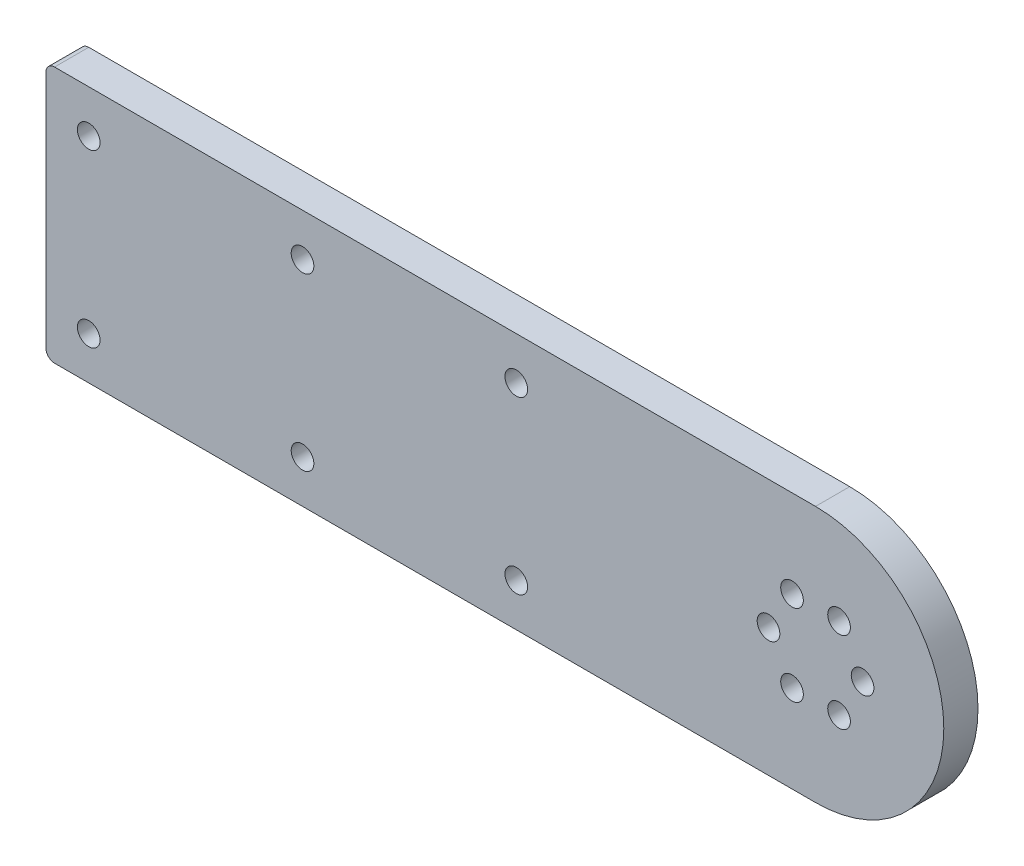
ISO-10303-21;
HEADER;
FILE_DESCRIPTION(('STEP AP214'),'2;1');
FILE_NAME('part.step','',(''),(''),'','','');
FILE_SCHEMA(('AUTOMOTIVE_DESIGN { 1 0 10303 214 1 1 1 1 }'));
ENDSEC;
DATA;
#1=APPLICATION_CONTEXT('core data for automotive mechanical design processes');
#2=APPLICATION_PROTOCOL_DEFINITION('international standard','automotive_design',2000,#1);
#3=PRODUCT_CONTEXT('',#1,'mechanical');
#4=PRODUCT('Part','Part','',(#3));
#5=PRODUCT_RELATED_PRODUCT_CATEGORY('part','',(#4));
#6=PRODUCT_DEFINITION_FORMATION('','',#4);
#7=PRODUCT_DEFINITION_CONTEXT('part definition',#1,'design');
#8=PRODUCT_DEFINITION('design','',#6,#7);
#9=PRODUCT_DEFINITION_SHAPE('','',#8);
#10=(LENGTH_UNIT() NAMED_UNIT(*) SI_UNIT(.MILLI.,.METRE.));
#11=(NAMED_UNIT(*) PLANE_ANGLE_UNIT() SI_UNIT($,.RADIAN.));
#12=(NAMED_UNIT(*) SI_UNIT($,.STERADIAN.) SOLID_ANGLE_UNIT());
#13=UNCERTAINTY_MEASURE_WITH_UNIT(LENGTH_MEASURE(1.E-05),#10,'distance_accuracy_value','');
#14=(GEOMETRIC_REPRESENTATION_CONTEXT(3) GLOBAL_UNCERTAINTY_ASSIGNED_CONTEXT((#13)) GLOBAL_UNIT_ASSIGNED_CONTEXT((#10,
#11,#12)) REPRESENTATION_CONTEXT('',''));
#15=CARTESIAN_POINT('',(0.,0.,0.));
#16=DIRECTION('',(0.,0.,1.));
#17=DIRECTION('',(1.,0.,0.));
#18=AXIS2_PLACEMENT_3D('',#15,#16,#17);
#19=CARTESIAN_POINT('',(380.,0.,0.));
#20=DIRECTION('',(0.,0.,1.));
#21=DIRECTION('',(1.,0.,0.));
#22=AXIS2_PLACEMENT_3D('',#19,#20,#21);
#23=CYLINDRICAL_SURFACE('',#22,30.);
#24=CARTESIAN_POINT('',(380.,0.,0.));
#25=DIRECTION('',(0.,0.,1.));
#26=DIRECTION('',(1.,0.,0.));
#27=AXIS2_PLACEMENT_3D('',#24,#25,#26);
#28=CIRCLE('',#27,30.);
#29=CARTESIAN_POINT('',(380.,-30.,0.));
#30=VERTEX_POINT('',#29);
#31=CARTESIAN_POINT('',(380.,30.,0.));
#32=VERTEX_POINT('',#31);
#33=EDGE_CURVE('E213',#30,#32,#28,.T.);
#34=ORIENTED_EDGE('',*,*,#33,.T.);
#35=DIRECTION('',(0.,0.,1.));
#36=VECTOR('',#35,1.);
#37=CARTESIAN_POINT('',(380.,30.,0.));
#38=LINE('',#37,#36);
#39=CARTESIAN_POINT('',(380.,30.,8.));
#40=VERTEX_POINT('',#39);
#41=EDGE_CURVE('E11',#32,#40,#38,.T.);
#42=ORIENTED_EDGE('',*,*,#41,.T.);
#43=CARTESIAN_POINT('',(380.,0.,8.));
#44=DIRECTION('',(0.,0.,1.));
#45=DIRECTION('',(1.,0.,0.));
#46=AXIS2_PLACEMENT_3D('',#43,#44,#45);
#47=CIRCLE('',#46,30.);
#48=CARTESIAN_POINT('',(380.,-30.,8.));
#49=VERTEX_POINT('',#48);
#50=EDGE_CURVE('E313',#49,#40,#47,.T.);
#51=ORIENTED_EDGE('',*,*,#50,.F.);
#52=DIRECTION('',(0.,0.,1.));
#53=VECTOR('',#52,1.);
#54=CARTESIAN_POINT('',(380.,-30.,0.));
#55=LINE('',#54,#53);
#56=EDGE_CURVE('E202',#30,#49,#55,.T.);
#57=ORIENTED_EDGE('',*,*,#56,.F.);
#58=EDGE_LOOP('',(#34,#42,#51,#57));
#59=FACE_BOUND('',#58,.T.);
#60=ADVANCED_FACE('F17',(#59),#23,.T.);
#61=CARTESIAN_POINT('',(380.,30.,0.));
#62=DIRECTION('',(0.,1.,0.));
#63=DIRECTION('',(1.,0.,0.));
#64=AXIS2_PLACEMENT_3D('',#61,#62,#63);
#65=PLANE('',#64);
#66=DIRECTION('',(0.,0.,-1.));
#67=VECTOR('',#66,1.);
#68=CARTESIAN_POINT('',(202.,30.,4.));
#69=LINE('',#68,#67);
#70=CARTESIAN_POINT('',(202.,30.,8.));
#71=VERTEX_POINT('',#70);
#72=CARTESIAN_POINT('',(202.,30.,0.));
#73=VERTEX_POINT('',#72);
#74=EDGE_CURVE('E193',#71,#73,#69,.T.);
#75=ORIENTED_EDGE('',*,*,#74,.F.);
#76=DIRECTION('',(-1.,0.,0.));
#77=VECTOR('',#76,1.);
#78=CARTESIAN_POINT('',(380.,30.,8.));
#79=LINE('',#78,#77);
#80=EDGE_CURVE('E320',#40,#71,#79,.T.);
#81=ORIENTED_EDGE('',*,*,#80,.F.);
#82=ORIENTED_EDGE('',*,*,#41,.F.);
#83=DIRECTION('',(-1.,0.,0.));
#84=VECTOR('',#83,1.);
#85=CARTESIAN_POINT('',(380.,30.,0.));
#86=LINE('',#85,#84);
#87=EDGE_CURVE('E206',#32,#73,#86,.T.);
#88=ORIENTED_EDGE('',*,*,#87,.T.);
#89=EDGE_LOOP('',(#75,#81,#82,#88));
#90=FACE_BOUND('',#89,.T.);
#91=ADVANCED_FACE('F446',(#90),#65,.T.);
#92=CARTESIAN_POINT('',(391.,0.,-436.144120753613));
#93=DIRECTION('',(0.,0.,1.));
#94=DIRECTION('',(1.,0.,0.));
#95=AXIS2_PLACEMENT_3D('',#92,#93,#94);
#96=CYLINDRICAL_SURFACE('',#95,2.65);
#97=CARTESIAN_POINT('',(391.,0.,8.));
#98=DIRECTION('',(0.,0.,-1.));
#99=DIRECTION('',(1.,0.,0.));
#100=AXIS2_PLACEMENT_3D('',#97,#98,#99);
#101=CIRCLE('',#100,2.65);
#102=CARTESIAN_POINT('',(388.35,0.,8.));
#103=VERTEX_POINT('',#102);
#104=EDGE_CURVE('E189',#103,#103,#101,.T.);
#105=ORIENTED_EDGE('',*,*,#104,.F.);
#106=DIRECTION('',(0.,0.,-1.));
#107=VECTOR('',#106,1.);
#108=CARTESIAN_POINT('',(388.35,0.,-436.144120753613));
#109=LINE('',#108,#107);
#110=CARTESIAN_POINT('',(388.35,0.,0.));
#111=VERTEX_POINT('',#110);
#112=EDGE_CURVE('E27',#103,#111,#109,.T.);
#113=ORIENTED_EDGE('',*,*,#112,.T.);
#114=CARTESIAN_POINT('',(391.,0.,0.));
#115=DIRECTION('',(0.,0.,1.));
#116=DIRECTION('',(1.,0.,0.));
#117=AXIS2_PLACEMENT_3D('',#114,#115,#116);
#118=CIRCLE('',#117,2.65);
#119=EDGE_CURVE('E217',#111,#111,#118,.T.);
#120=ORIENTED_EDGE('',*,*,#119,.F.);
#121=ORIENTED_EDGE('',*,*,#112,.F.);
#122=EDGE_LOOP('',(#105,#113,#120,#121));
#123=FACE_BOUND('',#122,.T.);
#124=ADVANCED_FACE('F452',(#123),#96,.F.);
#125=CARTESIAN_POINT('',(385.5,9.52627944162884,-436.144120753613));
#126=DIRECTION('',(0.,0.,1.));
#127=DIRECTION('',(1.,0.,0.));
#128=AXIS2_PLACEMENT_3D('',#125,#126,#127);
#129=CYLINDRICAL_SURFACE('',#128,2.65);
#130=CARTESIAN_POINT('',(385.5,9.52627944162884,8.));
#131=DIRECTION('',(0.,0.,-1.));
#132=DIRECTION('',(1.,0.,0.));
#133=AXIS2_PLACEMENT_3D('',#130,#131,#132);
#134=CIRCLE('',#133,2.65);
#135=CARTESIAN_POINT('',(382.85,9.52627944162884,8.));
#136=VERTEX_POINT('',#135);
#137=EDGE_CURVE('E184',#136,#136,#134,.T.);
#138=ORIENTED_EDGE('',*,*,#137,.F.);
#139=DIRECTION('',(0.,0.,-1.));
#140=VECTOR('',#139,1.);
#141=CARTESIAN_POINT('',(382.85,9.52627944162884,-436.144120753613));
#142=LINE('',#141,#140);
#143=CARTESIAN_POINT('',(382.85,9.52627944162884,0.));
#144=VERTEX_POINT('',#143);
#145=EDGE_CURVE('E20',#136,#144,#142,.T.);
#146=ORIENTED_EDGE('',*,*,#145,.T.);
#147=CARTESIAN_POINT('',(385.5,9.52627944162884,0.));
#148=DIRECTION('',(0.,0.,1.));
#149=DIRECTION('',(1.,0.,0.));
#150=AXIS2_PLACEMENT_3D('',#147,#148,#149);
#151=CIRCLE('',#150,2.65);
#152=EDGE_CURVE('E223',#144,#144,#151,.T.);
#153=ORIENTED_EDGE('',*,*,#152,.F.);
#154=ORIENTED_EDGE('',*,*,#145,.F.);
#155=EDGE_LOOP('',(#138,#146,#153,#154));
#156=FACE_BOUND('',#155,.T.);
#157=ADVANCED_FACE('F408',(#156),#129,.F.);
#158=CARTESIAN_POINT('',(374.5,9.52627944162877,-436.144120753613));
#159=DIRECTION('',(0.,0.,1.));
#160=DIRECTION('',(1.,0.,0.));
#161=AXIS2_PLACEMENT_3D('',#158,#159,#160);
#162=CYLINDRICAL_SURFACE('',#161,2.65);
#163=CARTESIAN_POINT('',(374.5,9.52627944162877,8.));
#164=DIRECTION('',(0.,0.,-1.));
#165=DIRECTION('',(1.,0.,0.));
#166=AXIS2_PLACEMENT_3D('',#163,#164,#165);
#167=CIRCLE('',#166,2.65);
#168=CARTESIAN_POINT('',(371.85,9.52627944162877,8.));
#169=VERTEX_POINT('',#168);
#170=EDGE_CURVE('E181',#169,#169,#167,.T.);
#171=ORIENTED_EDGE('',*,*,#170,.F.);
#172=DIRECTION('',(0.,0.,-1.));
#173=VECTOR('',#172,1.);
#174=CARTESIAN_POINT('',(371.85,9.52627944162877,-436.144120753613));
#175=LINE('',#174,#173);
#176=CARTESIAN_POINT('',(371.85,9.52627944162877,0.));
#177=VERTEX_POINT('',#176);
#178=EDGE_CURVE('E145',#169,#177,#175,.T.);
#179=ORIENTED_EDGE('',*,*,#178,.T.);
#180=CARTESIAN_POINT('',(374.5,9.52627944162877,0.));
#181=DIRECTION('',(0.,0.,1.));
#182=DIRECTION('',(1.,0.,0.));
#183=AXIS2_PLACEMENT_3D('',#180,#181,#182);
#184=CIRCLE('',#183,2.65);
#185=EDGE_CURVE('E227',#177,#177,#184,.T.);
#186=ORIENTED_EDGE('',*,*,#185,.F.);
#187=ORIENTED_EDGE('',*,*,#178,.F.);
#188=EDGE_LOOP('',(#171,#179,#186,#187));
#189=FACE_BOUND('',#188,.T.);
#190=ADVANCED_FACE('F488',(#189),#162,.F.);
#191=CARTESIAN_POINT('',(369.,0.,-436.144120753613));
#192=DIRECTION('',(0.,0.,1.));
#193=DIRECTION('',(1.,0.,0.));
#194=AXIS2_PLACEMENT_3D('',#191,#192,#193);
#195=CYLINDRICAL_SURFACE('',#194,2.65);
#196=CARTESIAN_POINT('',(369.,0.,8.));
#197=DIRECTION('',(0.,0.,-1.));
#198=DIRECTION('',(1.,0.,0.));
#199=AXIS2_PLACEMENT_3D('',#196,#197,#198);
#200=CIRCLE('',#199,2.65);
#201=CARTESIAN_POINT('',(366.35,0.,8.));
#202=VERTEX_POINT('',#201);
#203=EDGE_CURVE('E177',#202,#202,#200,.T.);
#204=ORIENTED_EDGE('',*,*,#203,.F.);
#205=DIRECTION('',(0.,0.,-1.));
#206=VECTOR('',#205,1.);
#207=CARTESIAN_POINT('',(366.35,0.,-436.144120753613));
#208=LINE('',#207,#206);
#209=CARTESIAN_POINT('',(366.35,0.,0.));
#210=VERTEX_POINT('',#209);
#211=EDGE_CURVE('E143',#202,#210,#208,.T.);
#212=ORIENTED_EDGE('',*,*,#211,.T.);
#213=CARTESIAN_POINT('',(369.,0.,0.));
#214=DIRECTION('',(0.,0.,1.));
#215=DIRECTION('',(1.,0.,0.));
#216=AXIS2_PLACEMENT_3D('',#213,#214,#215);
#217=CIRCLE('',#216,2.65);
#218=EDGE_CURVE('E230',#210,#210,#217,.T.);
#219=ORIENTED_EDGE('',*,*,#218,.F.);
#220=ORIENTED_EDGE('',*,*,#211,.F.);
#221=EDGE_LOOP('',(#204,#212,#219,#220));
#222=FACE_BOUND('',#221,.T.);
#223=ADVANCED_FACE('F491',(#222),#195,.F.);
#224=CARTESIAN_POINT('',(374.5,-9.52627944162884,-436.144120753613));
#225=DIRECTION('',(0.,0.,1.));
#226=DIRECTION('',(1.,0.,0.));
#227=AXIS2_PLACEMENT_3D('',#224,#225,#226);
#228=CYLINDRICAL_SURFACE('',#227,2.65);
#229=CARTESIAN_POINT('',(374.5,-9.52627944162884,8.));
#230=DIRECTION('',(0.,0.,-1.));
#231=DIRECTION('',(1.,0.,0.));
#232=AXIS2_PLACEMENT_3D('',#229,#230,#231);
#233=CIRCLE('',#232,2.65);
#234=CARTESIAN_POINT('',(371.85,-9.52627944162884,8.));
#235=VERTEX_POINT('',#234);
#236=EDGE_CURVE('E173',#235,#235,#233,.T.);
#237=ORIENTED_EDGE('',*,*,#236,.F.);
#238=DIRECTION('',(0.,0.,-1.));
#239=VECTOR('',#238,1.);
#240=CARTESIAN_POINT('',(371.85,-9.52627944162884,-436.144120753613));
#241=LINE('',#240,#239);
#242=CARTESIAN_POINT('',(371.85,-9.52627944162884,0.));
#243=VERTEX_POINT('',#242);
#244=EDGE_CURVE('E140',#235,#243,#241,.T.);
#245=ORIENTED_EDGE('',*,*,#244,.T.);
#246=CARTESIAN_POINT('',(374.5,-9.52627944162884,0.));
#247=DIRECTION('',(0.,0.,1.));
#248=DIRECTION('',(1.,0.,0.));
#249=AXIS2_PLACEMENT_3D('',#246,#247,#248);
#250=CIRCLE('',#249,2.65);
#251=EDGE_CURVE('E233',#243,#243,#250,.T.);
#252=ORIENTED_EDGE('',*,*,#251,.F.);
#253=ORIENTED_EDGE('',*,*,#244,.F.);
#254=EDGE_LOOP('',(#237,#245,#252,#253));
#255=FACE_BOUND('',#254,.T.);
#256=ADVANCED_FACE('F495',(#255),#228,.F.);
#257=CARTESIAN_POINT('',(385.5,-9.52627944162884,-436.144120753613));
#258=DIRECTION('',(0.,0.,1.));
#259=DIRECTION('',(1.,0.,0.));
#260=AXIS2_PLACEMENT_3D('',#257,#258,#259);
#261=CYLINDRICAL_SURFACE('',#260,2.65);
#262=CARTESIAN_POINT('',(385.5,-9.52627944162884,8.));
#263=DIRECTION('',(0.,0.,-1.));
#264=DIRECTION('',(1.,0.,0.));
#265=AXIS2_PLACEMENT_3D('',#262,#263,#264);
#266=CIRCLE('',#265,2.65);
#267=CARTESIAN_POINT('',(382.85,-9.52627944162884,8.));
#268=VERTEX_POINT('',#267);
#269=EDGE_CURVE('E171',#268,#268,#266,.T.);
#270=ORIENTED_EDGE('',*,*,#269,.F.);
#271=DIRECTION('',(0.,0.,-1.));
#272=VECTOR('',#271,1.);
#273=CARTESIAN_POINT('',(382.85,-9.52627944162884,-436.144120753613));
#274=LINE('',#273,#272);
#275=CARTESIAN_POINT('',(382.85,-9.52627944162884,0.));
#276=VERTEX_POINT('',#275);
#277=EDGE_CURVE('E137',#268,#276,#274,.T.);
#278=ORIENTED_EDGE('',*,*,#277,.T.);
#279=CARTESIAN_POINT('',(385.5,-9.52627944162884,0.));
#280=DIRECTION('',(0.,0.,1.));
#281=DIRECTION('',(1.,0.,0.));
#282=AXIS2_PLACEMENT_3D('',#279,#280,#281);
#283=CIRCLE('',#282,2.65);
#284=EDGE_CURVE('E237',#276,#276,#283,.T.);
#285=ORIENTED_EDGE('',*,*,#284,.F.);
#286=ORIENTED_EDGE('',*,*,#277,.F.);
#287=EDGE_LOOP('',(#270,#278,#285,#286));
#288=FACE_BOUND('',#287,.T.);
#289=ADVANCED_FACE('F492',(#288),#261,.F.);
#290=CARTESIAN_POINT('',(210.,20.,444.144120753613));
#291=DIRECTION('',(0.,0.,1.));
#292=DIRECTION('',(1.,0.,0.));
#293=AXIS2_PLACEMENT_3D('',#290,#291,#292);
#294=CYLINDRICAL_SURFACE('',#293,2.65);
#295=CARTESIAN_POINT('',(210.,20.,0.));
#296=DIRECTION('',(0.,0.,1.));
#297=DIRECTION('',(1.,0.,0.));
#298=AXIS2_PLACEMENT_3D('',#295,#296,#297);
#299=CIRCLE('',#298,2.65);
#300=CARTESIAN_POINT('',(207.35,20.,0.));
#301=VERTEX_POINT('',#300);
#302=EDGE_CURVE('E240',#301,#301,#299,.T.);
#303=ORIENTED_EDGE('',*,*,#302,.F.);
#304=DIRECTION('',(0.,0.,1.));
#305=VECTOR('',#304,1.);
#306=CARTESIAN_POINT('',(207.35,20.,444.144120753613));
#307=LINE('',#306,#305);
#308=CARTESIAN_POINT('',(207.35,20.,8.));
#309=VERTEX_POINT('',#308);
#310=EDGE_CURVE('E141',#301,#309,#307,.T.);
#311=ORIENTED_EDGE('',*,*,#310,.T.);
#312=CARTESIAN_POINT('',(210.,20.,8.));
#313=DIRECTION('',(0.,0.,-1.));
#314=DIRECTION('',(1.,0.,0.));
#315=AXIS2_PLACEMENT_3D('',#312,#313,#314);
#316=CIRCLE('',#315,2.65);
#317=EDGE_CURVE('E167',#309,#309,#316,.T.);
#318=ORIENTED_EDGE('',*,*,#317,.F.);
#319=ORIENTED_EDGE('',*,*,#310,.F.);
#320=EDGE_LOOP('',(#303,#311,#318,#319));
#321=FACE_BOUND('',#320,.T.);
#322=ADVANCED_FACE('F494',(#321),#294,.F.);
#323=CARTESIAN_POINT('',(260.,20.,444.144120753613));
#324=DIRECTION('',(0.,0.,1.));
#325=DIRECTION('',(1.,0.,0.));
#326=AXIS2_PLACEMENT_3D('',#323,#324,#325);
#327=CYLINDRICAL_SURFACE('',#326,2.65);
#328=CARTESIAN_POINT('',(260.,20.,0.));
#329=DIRECTION('',(0.,0.,1.));
#330=DIRECTION('',(1.,0.,0.));
#331=AXIS2_PLACEMENT_3D('',#328,#329,#330);
#332=CIRCLE('',#331,2.65);
#333=CARTESIAN_POINT('',(257.35,20.,0.));
#334=VERTEX_POINT('',#333);
#335=EDGE_CURVE('E130',#334,#334,#332,.T.);
#336=ORIENTED_EDGE('',*,*,#335,.F.);
#337=DIRECTION('',(0.,0.,1.));
#338=VECTOR('',#337,1.);
#339=CARTESIAN_POINT('',(257.35,20.,444.144120753613));
#340=LINE('',#339,#338);
#341=CARTESIAN_POINT('',(257.35,20.,8.));
#342=VERTEX_POINT('',#341);
#343=EDGE_CURVE('E207',#334,#342,#340,.T.);
#344=ORIENTED_EDGE('',*,*,#343,.T.);
#345=CARTESIAN_POINT('',(260.,20.,8.));
#346=DIRECTION('',(0.,0.,-1.));
#347=DIRECTION('',(1.,0.,0.));
#348=AXIS2_PLACEMENT_3D('',#345,#346,#347);
#349=CIRCLE('',#348,2.65);
#350=EDGE_CURVE('E172',#342,#342,#349,.T.);
#351=ORIENTED_EDGE('',*,*,#350,.F.);
#352=ORIENTED_EDGE('',*,*,#343,.F.);
#353=EDGE_LOOP('',(#336,#344,#351,#352));
#354=FACE_BOUND('',#353,.T.);
#355=ADVANCED_FACE('F254',(#354),#327,.F.);
#356=CARTESIAN_POINT('',(310.,20.,444.144120753613));
#357=DIRECTION('',(0.,0.,1.));
#358=DIRECTION('',(1.,0.,0.));
#359=AXIS2_PLACEMENT_3D('',#356,#357,#358);
#360=CYLINDRICAL_SURFACE('',#359,2.65);
#361=CARTESIAN_POINT('',(310.,20.,0.));
#362=DIRECTION('',(0.,0.,1.));
#363=DIRECTION('',(1.,0.,0.));
#364=AXIS2_PLACEMENT_3D('',#361,#362,#363);
#365=CIRCLE('',#364,2.65);
#366=CARTESIAN_POINT('',(307.35,20.,0.));
#367=VERTEX_POINT('',#366);
#368=EDGE_CURVE('E119',#367,#367,#365,.T.);
#369=ORIENTED_EDGE('',*,*,#368,.F.);
#370=DIRECTION('',(0.,0.,1.));
#371=VECTOR('',#370,1.);
#372=CARTESIAN_POINT('',(307.35,20.,444.144120753613));
#373=LINE('',#372,#371);
#374=CARTESIAN_POINT('',(307.35,20.,8.));
#375=VERTEX_POINT('',#374);
#376=EDGE_CURVE('E111',#367,#375,#373,.T.);
#377=ORIENTED_EDGE('',*,*,#376,.T.);
#378=CARTESIAN_POINT('',(310.,20.,8.));
#379=DIRECTION('',(0.,0.,-1.));
#380=DIRECTION('',(1.,0.,0.));
#381=AXIS2_PLACEMENT_3D('',#378,#379,#380);
#382=CIRCLE('',#381,2.65);
#383=EDGE_CURVE('E264',#375,#375,#382,.T.);
#384=ORIENTED_EDGE('',*,*,#383,.F.);
#385=ORIENTED_EDGE('',*,*,#376,.F.);
#386=EDGE_LOOP('',(#369,#377,#384,#385));
#387=FACE_BOUND('',#386,.T.);
#388=ADVANCED_FACE('F427',(#387),#360,.F.);
#389=CARTESIAN_POINT('',(210.,-20.,444.144120753613));
#390=DIRECTION('',(0.,0.,1.));
#391=DIRECTION('',(1.,0.,0.));
#392=AXIS2_PLACEMENT_3D('',#389,#390,#391);
#393=CYLINDRICAL_SURFACE('',#392,2.65);
#394=CARTESIAN_POINT('',(210.,-20.,0.));
#395=DIRECTION('',(0.,0.,1.));
#396=DIRECTION('',(1.,0.,0.));
#397=AXIS2_PLACEMENT_3D('',#394,#395,#396);
#398=CIRCLE('',#397,2.65);
#399=CARTESIAN_POINT('',(207.35,-20.,0.));
#400=VERTEX_POINT('',#399);
#401=EDGE_CURVE('E106',#400,#400,#398,.T.);
#402=ORIENTED_EDGE('',*,*,#401,.F.);
#403=DIRECTION('',(0.,0.,1.));
#404=VECTOR('',#403,1.);
#405=CARTESIAN_POINT('',(207.35,-20.,444.144120753613));
#406=LINE('',#405,#404);
#407=CARTESIAN_POINT('',(207.35,-20.,8.));
#408=VERTEX_POINT('',#407);
#409=EDGE_CURVE('E103',#400,#408,#406,.T.);
#410=ORIENTED_EDGE('',*,*,#409,.T.);
#411=CARTESIAN_POINT('',(210.,-20.,8.));
#412=DIRECTION('',(0.,0.,-1.));
#413=DIRECTION('',(1.,0.,0.));
#414=AXIS2_PLACEMENT_3D('',#411,#412,#413);
#415=CIRCLE('',#414,2.65);
#416=EDGE_CURVE('E109',#408,#408,#415,.T.);
#417=ORIENTED_EDGE('',*,*,#416,.F.);
#418=ORIENTED_EDGE('',*,*,#409,.F.);
#419=EDGE_LOOP('',(#402,#410,#417,#418));
#420=FACE_BOUND('',#419,.T.);
#421=ADVANCED_FACE('F105',(#420),#393,.F.);
#422=CARTESIAN_POINT('',(260.,-20.,444.144120753613));
#423=DIRECTION('',(0.,0.,1.));
#424=DIRECTION('',(1.,0.,0.));
#425=AXIS2_PLACEMENT_3D('',#422,#423,#424);
#426=CYLINDRICAL_SURFACE('',#425,2.65);
#427=CARTESIAN_POINT('',(260.,-20.,0.));
#428=DIRECTION('',(0.,0.,1.));
#429=DIRECTION('',(1.,0.,0.));
#430=AXIS2_PLACEMENT_3D('',#427,#428,#429);
#431=CIRCLE('',#430,2.65);
#432=CARTESIAN_POINT('',(257.35,-20.,0.));
#433=VERTEX_POINT('',#432);
#434=EDGE_CURVE('E118',#433,#433,#431,.T.);
#435=ORIENTED_EDGE('',*,*,#434,.F.);
#436=DIRECTION('',(0.,0.,1.));
#437=VECTOR('',#436,1.);
#438=CARTESIAN_POINT('',(257.35,-20.,444.144120753613));
#439=LINE('',#438,#437);
#440=CARTESIAN_POINT('',(257.35,-20.,8.));
#441=VERTEX_POINT('',#440);
#442=EDGE_CURVE('E112',#433,#441,#439,.T.);
#443=ORIENTED_EDGE('',*,*,#442,.T.);
#444=CARTESIAN_POINT('',(260.,-20.,8.));
#445=DIRECTION('',(0.,0.,-1.));
#446=DIRECTION('',(1.,0.,0.));
#447=AXIS2_PLACEMENT_3D('',#444,#445,#446);
#448=CIRCLE('',#447,2.65);
#449=EDGE_CURVE('E336',#441,#441,#448,.T.);
#450=ORIENTED_EDGE('',*,*,#449,.F.);
#451=ORIENTED_EDGE('',*,*,#442,.F.);
#452=EDGE_LOOP('',(#435,#443,#450,#451));
#453=FACE_BOUND('',#452,.T.);
#454=ADVANCED_FACE('F441',(#453),#426,.F.);
#455=CARTESIAN_POINT('',(310.,-20.,444.144120753613));
#456=DIRECTION('',(0.,0.,1.));
#457=DIRECTION('',(1.,0.,0.));
#458=AXIS2_PLACEMENT_3D('',#455,#456,#457);
#459=CYLINDRICAL_SURFACE('',#458,2.65);
#460=CARTESIAN_POINT('',(310.,-20.,0.));
#461=DIRECTION('',(0.,0.,1.));
#462=DIRECTION('',(1.,0.,0.));
#463=AXIS2_PLACEMENT_3D('',#460,#461,#462);
#464=CIRCLE('',#463,2.65);
#465=CARTESIAN_POINT('',(307.35,-20.,0.));
#466=VERTEX_POINT('',#465);
#467=EDGE_CURVE('E127',#466,#466,#464,.T.);
#468=ORIENTED_EDGE('',*,*,#467,.F.);
#469=DIRECTION('',(0.,0.,1.));
#470=VECTOR('',#469,1.);
#471=CARTESIAN_POINT('',(307.35,-20.,444.144120753613));
#472=LINE('',#471,#470);
#473=CARTESIAN_POINT('',(307.35,-20.,8.));
#474=VERTEX_POINT('',#473);
#475=EDGE_CURVE('E40',#466,#474,#472,.T.);
#476=ORIENTED_EDGE('',*,*,#475,.T.);
#477=CARTESIAN_POINT('',(310.,-20.,8.));
#478=DIRECTION('',(0.,0.,-1.));
#479=DIRECTION('',(1.,0.,0.));
#480=AXIS2_PLACEMENT_3D('',#477,#478,#479);
#481=CIRCLE('',#480,2.65);
#482=EDGE_CURVE('E331',#474,#474,#481,.T.);
#483=ORIENTED_EDGE('',*,*,#482,.F.);
#484=ORIENTED_EDGE('',*,*,#475,.F.);
#485=EDGE_LOOP('',(#468,#476,#483,#484));
#486=FACE_BOUND('',#485,.T.);
#487=ADVANCED_FACE('F430',(#486),#459,.F.);
#488=CARTESIAN_POINT('',(190.,0.,0.));
#489=DIRECTION('',(0.,0.,1.));
#490=DIRECTION('',(1.,0.,0.));
#491=AXIS2_PLACEMENT_3D('',#488,#489,#490);
#492=PLANE('',#491);
#493=ORIENTED_EDGE('',*,*,#467,.T.);
#494=EDGE_LOOP('',(#493));
#495=FACE_BOUND('',#494,.T.);
#496=ORIENTED_EDGE('',*,*,#434,.T.);
#497=EDGE_LOOP('',(#496));
#498=FACE_BOUND('',#497,.T.);
#499=ORIENTED_EDGE('',*,*,#401,.T.);
#500=EDGE_LOOP('',(#499));
#501=FACE_BOUND('',#500,.T.);
#502=ORIENTED_EDGE('',*,*,#368,.T.);
#503=EDGE_LOOP('',(#502));
#504=FACE_BOUND('',#503,.T.);
#505=ORIENTED_EDGE('',*,*,#335,.T.);
#506=EDGE_LOOP('',(#505));
#507=FACE_BOUND('',#506,.T.);
#508=ORIENTED_EDGE('',*,*,#302,.T.);
#509=EDGE_LOOP('',(#508));
#510=FACE_BOUND('',#509,.T.);
#511=ORIENTED_EDGE('',*,*,#284,.T.);
#512=EDGE_LOOP('',(#511));
#513=FACE_BOUND('',#512,.T.);
#514=ORIENTED_EDGE('',*,*,#251,.T.);
#515=EDGE_LOOP('',(#514));
#516=FACE_BOUND('',#515,.T.);
#517=ORIENTED_EDGE('',*,*,#218,.T.);
#518=EDGE_LOOP('',(#517));
#519=FACE_BOUND('',#518,.T.);
#520=ORIENTED_EDGE('',*,*,#185,.T.);
#521=EDGE_LOOP('',(#520));
#522=FACE_BOUND('',#521,.T.);
#523=ORIENTED_EDGE('',*,*,#152,.T.);
#524=EDGE_LOOP('',(#523));
#525=FACE_BOUND('',#524,.T.);
#526=ORIENTED_EDGE('',*,*,#119,.T.);
#527=EDGE_LOOP('',(#526));
#528=FACE_BOUND('',#527,.T.);
#529=CARTESIAN_POINT('',(202.,-28.,0.));
#530=DIRECTION('',(0.,0.,1.));
#531=DIRECTION('',(-0.70710678118654,-0.707106781186555,0.));
#532=AXIS2_PLACEMENT_3D('',#529,#530,#531);
#533=CIRCLE('',#532,2.);
#534=CARTESIAN_POINT('',(200.,-28.,0.));
#535=VERTEX_POINT('',#534);
#536=CARTESIAN_POINT('',(202.,-30.,0.));
#537=VERTEX_POINT('',#536);
#538=EDGE_CURVE('E272',#535,#537,#533,.T.);
#539=ORIENTED_EDGE('',*,*,#538,.F.);
#540=DIRECTION('',(0.,1.,0.));
#541=VECTOR('',#540,1.);
#542=CARTESIAN_POINT('',(200.,15.,0.));
#543=LINE('',#542,#541);
#544=CARTESIAN_POINT('',(200.,28.,0.));
#545=VERTEX_POINT('',#544);
#546=EDGE_CURVE('E299',#535,#545,#543,.T.);
#547=ORIENTED_EDGE('',*,*,#546,.T.);
#548=CARTESIAN_POINT('',(202.,28.,0.));
#549=DIRECTION('',(0.,0.,1.));
#550=DIRECTION('',(-0.70710678118654,0.707106781186555,0.));
#551=AXIS2_PLACEMENT_3D('',#548,#549,#550);
#552=CIRCLE('',#551,2.);
#553=EDGE_CURVE('E197',#73,#545,#552,.T.);
#554=ORIENTED_EDGE('',*,*,#553,.F.);
#555=ORIENTED_EDGE('',*,*,#87,.F.);
#556=ORIENTED_EDGE('',*,*,#33,.F.);
#557=DIRECTION('',(1.,0.,0.));
#558=VECTOR('',#557,1.);
#559=CARTESIAN_POINT('',(0.,-30.,0.));
#560=LINE('',#559,#558);
#561=EDGE_CURVE('E198',#537,#30,#560,.T.);
#562=ORIENTED_EDGE('',*,*,#561,.F.);
#563=EDGE_LOOP('',(#539,#547,#554,#555,#556,#562));
#564=FACE_BOUND('',#563,.T.);
#565=ADVANCED_FACE('F115',(#495,#498,#501,#504,#507,#510,#513,#516,#519,#522,#525,#528,#564),
#492,.F.);
#566=CARTESIAN_POINT('',(0.,-30.,0.));
#567=DIRECTION('',(0.,-1.,0.));
#568=DIRECTION('',(-1.,0.,0.));
#569=AXIS2_PLACEMENT_3D('',#566,#567,#568);
#570=PLANE('',#569);
#571=DIRECTION('',(0.,0.,1.));
#572=VECTOR('',#571,1.);
#573=CARTESIAN_POINT('',(202.,-30.,4.));
#574=LINE('',#573,#572);
#575=CARTESIAN_POINT('',(202.,-30.,8.));
#576=VERTEX_POINT('',#575);
#577=EDGE_CURVE('E276',#537,#576,#574,.T.);
#578=ORIENTED_EDGE('',*,*,#577,.F.);
#579=ORIENTED_EDGE('',*,*,#561,.T.);
#580=ORIENTED_EDGE('',*,*,#56,.T.);
#581=DIRECTION('',(1.,0.,0.));
#582=VECTOR('',#581,1.);
#583=CARTESIAN_POINT('',(0.,-30.,8.));
#584=LINE('',#583,#582);
#585=EDGE_CURVE('E308',#576,#49,#584,.T.);
#586=ORIENTED_EDGE('',*,*,#585,.F.);
#587=EDGE_LOOP('',(#578,#579,#580,#586));
#588=FACE_BOUND('',#587,.T.);
#589=ADVANCED_FACE('F429',(#588),#570,.T.);
#590=CARTESIAN_POINT('',(202.,28.,4.));
#591=DIRECTION('',(0.,0.,1.));
#592=DIRECTION('',(-0.70710678118654,0.707106781186555,0.));
#593=AXIS2_PLACEMENT_3D('',#590,#591,#592);
#594=CYLINDRICAL_SURFACE('',#593,2.);
#595=CARTESIAN_POINT('',(202.,28.,8.));
#596=DIRECTION('',(0.,0.,-1.));
#597=DIRECTION('',(-0.70710678118654,0.707106781186555,0.));
#598=AXIS2_PLACEMENT_3D('',#595,#596,#597);
#599=CIRCLE('',#598,2.);
#600=CARTESIAN_POINT('',(200.,28.,8.));
#601=VERTEX_POINT('',#600);
#602=EDGE_CURVE('E327',#601,#71,#599,.T.);
#603=ORIENTED_EDGE('',*,*,#602,.T.);
#604=ORIENTED_EDGE('',*,*,#74,.T.);
#605=ORIENTED_EDGE('',*,*,#553,.T.);
#606=DIRECTION('',(0.,0.,1.));
#607=VECTOR('',#606,1.);
#608=CARTESIAN_POINT('',(200.,28.,4.));
#609=LINE('',#608,#607);
#610=EDGE_CURVE('E295',#545,#601,#609,.T.);
#611=ORIENTED_EDGE('',*,*,#610,.T.);
#612=EDGE_LOOP('',(#603,#604,#605,#611));
#613=FACE_BOUND('',#612,.T.);
#614=ADVANCED_FACE('F413',(#613),#594,.T.);
#615=CARTESIAN_POINT('',(190.,0.,8.));
#616=DIRECTION('',(0.,0.,1.));
#617=DIRECTION('',(1.,0.,0.));
#618=AXIS2_PLACEMENT_3D('',#615,#616,#617);
#619=PLANE('',#618);
#620=ORIENTED_EDGE('',*,*,#104,.T.);
#621=EDGE_LOOP('',(#620));
#622=FACE_BOUND('',#621,.T.);
#623=ORIENTED_EDGE('',*,*,#137,.T.);
#624=EDGE_LOOP('',(#623));
#625=FACE_BOUND('',#624,.T.);
#626=ORIENTED_EDGE('',*,*,#170,.T.);
#627=EDGE_LOOP('',(#626));
#628=FACE_BOUND('',#627,.T.);
#629=ORIENTED_EDGE('',*,*,#203,.T.);
#630=EDGE_LOOP('',(#629));
#631=FACE_BOUND('',#630,.T.);
#632=ORIENTED_EDGE('',*,*,#236,.T.);
#633=EDGE_LOOP('',(#632));
#634=FACE_BOUND('',#633,.T.);
#635=ORIENTED_EDGE('',*,*,#269,.T.);
#636=EDGE_LOOP('',(#635));
#637=FACE_BOUND('',#636,.T.);
#638=ORIENTED_EDGE('',*,*,#317,.T.);
#639=EDGE_LOOP('',(#638));
#640=FACE_BOUND('',#639,.T.);
#641=ORIENTED_EDGE('',*,*,#350,.T.);
#642=EDGE_LOOP('',(#641));
#643=FACE_BOUND('',#642,.T.);
#644=ORIENTED_EDGE('',*,*,#383,.T.);
#645=EDGE_LOOP('',(#644));
#646=FACE_BOUND('',#645,.T.);
#647=ORIENTED_EDGE('',*,*,#416,.T.);
#648=EDGE_LOOP('',(#647));
#649=FACE_BOUND('',#648,.T.);
#650=ORIENTED_EDGE('',*,*,#449,.T.);
#651=EDGE_LOOP('',(#650));
#652=FACE_BOUND('',#651,.T.);
#653=ORIENTED_EDGE('',*,*,#482,.T.);
#654=EDGE_LOOP('',(#653));
#655=FACE_BOUND('',#654,.T.);
#656=CARTESIAN_POINT('',(202.,-28.,8.));
#657=DIRECTION('',(0.,0.,-1.));
#658=DIRECTION('',(-0.70710678118654,-0.707106781186555,0.));
#659=AXIS2_PLACEMENT_3D('',#656,#657,#658);
#660=CIRCLE('',#659,2.);
#661=CARTESIAN_POINT('',(200.,-28.,8.));
#662=VERTEX_POINT('',#661);
#663=EDGE_CURVE('E279',#576,#662,#660,.T.);
#664=ORIENTED_EDGE('',*,*,#663,.F.);
#665=ORIENTED_EDGE('',*,*,#585,.T.);
#666=ORIENTED_EDGE('',*,*,#50,.T.);
#667=ORIENTED_EDGE('',*,*,#80,.T.);
#668=ORIENTED_EDGE('',*,*,#602,.F.);
#669=DIRECTION('',(0.,-1.,0.));
#670=VECTOR('',#669,1.);
#671=CARTESIAN_POINT('',(200.,15.,8.));
#672=LINE('',#671,#670);
#673=EDGE_CURVE('E294',#601,#662,#672,.T.);
#674=ORIENTED_EDGE('',*,*,#673,.T.);
#675=EDGE_LOOP('',(#664,#665,#666,#667,#668,#674));
#676=FACE_BOUND('',#675,.T.);
#677=ADVANCED_FACE('F348',(#622,#625,#628,#631,#634,#637,#640,#643,#646,#649,#652,#655,#676),
#619,.T.);
#678=CARTESIAN_POINT('',(200.,30.,8.));
#679=DIRECTION('',(1.,0.,0.));
#680=DIRECTION('',(0.,1.,0.));
#681=AXIS2_PLACEMENT_3D('',#678,#679,#680);
#682=PLANE('',#681);
#683=DIRECTION('',(0.,0.,-1.));
#684=VECTOR('',#683,1.);
#685=CARTESIAN_POINT('',(200.,-28.,4.));
#686=LINE('',#685,#684);
#687=EDGE_CURVE('E289',#662,#535,#686,.T.);
#688=ORIENTED_EDGE('',*,*,#687,.F.);
#689=ORIENTED_EDGE('',*,*,#673,.F.);
#690=ORIENTED_EDGE('',*,*,#610,.F.);
#691=ORIENTED_EDGE('',*,*,#546,.F.);
#692=EDGE_LOOP('',(#688,#689,#690,#691));
#693=FACE_BOUND('',#692,.T.);
#694=ADVANCED_FACE('F412',(#693),#682,.F.);
#695=CARTESIAN_POINT('',(202.,-28.,4.));
#696=DIRECTION('',(0.,0.,-1.));
#697=DIRECTION('',(-0.70710678118654,-0.707106781186555,0.));
#698=AXIS2_PLACEMENT_3D('',#695,#696,#697);
#699=CYLINDRICAL_SURFACE('',#698,2.);
#700=ORIENTED_EDGE('',*,*,#538,.T.);
#701=ORIENTED_EDGE('',*,*,#577,.T.);
#702=ORIENTED_EDGE('',*,*,#663,.T.);
#703=ORIENTED_EDGE('',*,*,#687,.T.);
#704=EDGE_LOOP('',(#700,#701,#702,#703));
#705=FACE_BOUND('',#704,.T.);
#706=ADVANCED_FACE('F479',(#705),#699,.T.);
#707=CLOSED_SHELL('',(#60,#91,#124,#157,#190,#223,#256,#289,#322,#355,#388,#421,#454,#487,#565,
#589,#614,#677,#694,#706));
#708=MANIFOLD_SOLID_BREP('B1',#707);
#709=ADVANCED_BREP_SHAPE_REPRESENTATION('',(#18,#708),#14);
#710=SHAPE_DEFINITION_REPRESENTATION(#9,#709);
ENDSEC;
END-ISO-10303-21;
